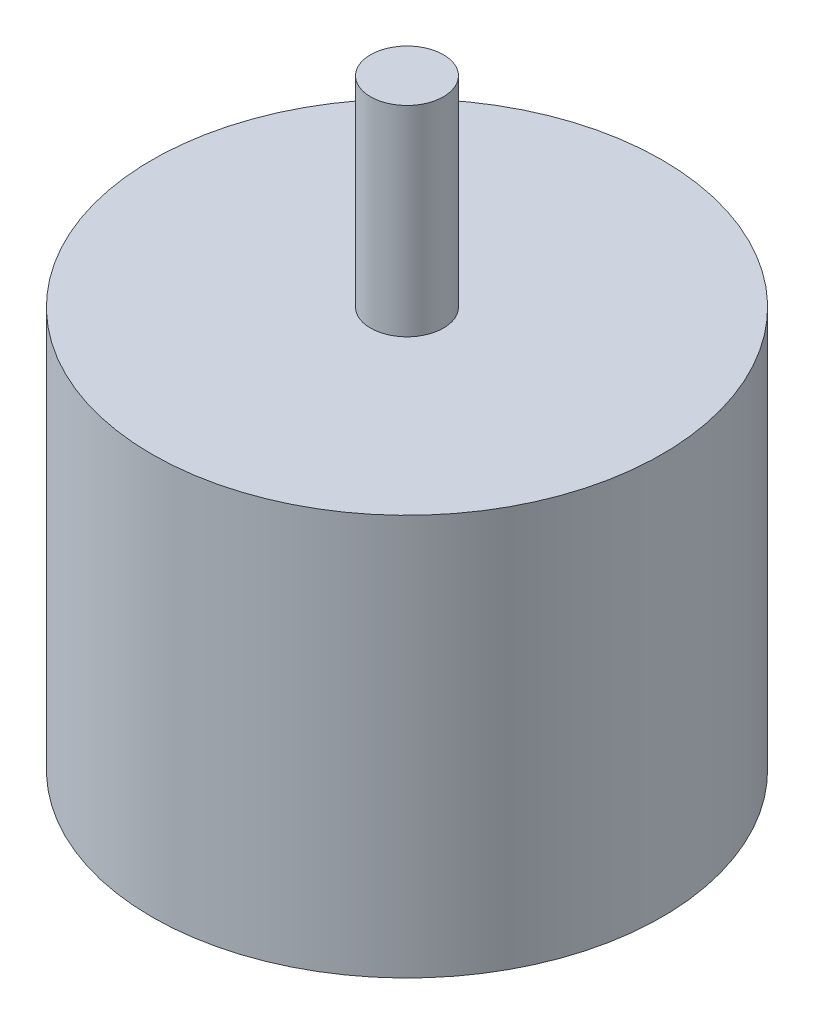
ISO-10303-21;
HEADER;
FILE_DESCRIPTION(('STEP AP214'),'2;1');
FILE_NAME('part.step','',(''),(''),'','','');
FILE_SCHEMA(('AUTOMOTIVE_DESIGN { 1 0 10303 214 1 1 1 1 }'));
ENDSEC;
DATA;
#1=APPLICATION_CONTEXT('core data for automotive mechanical design processes');
#2=APPLICATION_PROTOCOL_DEFINITION('international standard','automotive_design',2000,#1);
#3=PRODUCT_CONTEXT('',#1,'mechanical');
#4=PRODUCT('Part','Part','',(#3));
#5=PRODUCT_RELATED_PRODUCT_CATEGORY('part','',(#4));
#6=PRODUCT_DEFINITION_FORMATION('','',#4);
#7=PRODUCT_DEFINITION_CONTEXT('part definition',#1,'design');
#8=PRODUCT_DEFINITION('design','',#6,#7);
#9=PRODUCT_DEFINITION_SHAPE('','',#8);
#10=(LENGTH_UNIT() NAMED_UNIT(*) SI_UNIT(.MILLI.,.METRE.));
#11=(NAMED_UNIT(*) PLANE_ANGLE_UNIT() SI_UNIT($,.RADIAN.));
#12=(NAMED_UNIT(*) SI_UNIT($,.STERADIAN.) SOLID_ANGLE_UNIT());
#13=UNCERTAINTY_MEASURE_WITH_UNIT(LENGTH_MEASURE(1.E-05),#10,'distance_accuracy_value','');
#14=(GEOMETRIC_REPRESENTATION_CONTEXT(3) GLOBAL_UNCERTAINTY_ASSIGNED_CONTEXT((#13)) GLOBAL_UNIT_ASSIGNED_CONTEXT((#10,
#11,#12)) REPRESENTATION_CONTEXT('',''));
#15=CARTESIAN_POINT('',(0.,0.,0.));
#16=DIRECTION('',(0.,0.,1.));
#17=DIRECTION('',(1.,0.,0.));
#18=AXIS2_PLACEMENT_3D('',#15,#16,#17);
#19=CARTESIAN_POINT('',(0.,34.925,0.));
#20=DIRECTION('',(0.,1.,0.));
#21=DIRECTION('',(0.,0.,1.));
#22=AXIS2_PLACEMENT_3D('',#19,#20,#21);
#23=PLANE('',#22);
#24=CARTESIAN_POINT('',(0.,34.925,0.));
#25=DIRECTION('',(0.,1.,0.));
#26=DIRECTION('',(0.,0.,1.));
#27=AXIS2_PLACEMENT_3D('',#24,#25,#26);
#28=CIRCLE('',#27,22.225);
#29=CARTESIAN_POINT('',(0.,34.925,22.225));
#30=VERTEX_POINT('',#29);
#31=EDGE_CURVE('E10',#30,#30,#28,.T.);
#32=ORIENTED_EDGE('',*,*,#31,.T.);
#33=EDGE_LOOP('',(#32));
#34=FACE_BOUND('',#33,.T.);
#35=CARTESIAN_POINT('',(0.,34.925,0.));
#36=DIRECTION('',(0.,1.,0.));
#37=DIRECTION('',(0.,0.,1.));
#38=AXIS2_PLACEMENT_3D('',#35,#36,#37);
#39=CIRCLE('',#38,3.175);
#40=CARTESIAN_POINT('',(0.,34.925,3.175));
#41=VERTEX_POINT('',#40);
#42=EDGE_CURVE('E44',#41,#41,#39,.T.);
#43=ORIENTED_EDGE('',*,*,#42,.F.);
#44=EDGE_LOOP('',(#43));
#45=FACE_BOUND('',#44,.T.);
#46=ADVANCED_FACE('F31',(#34,#45),#23,.T.);
#47=CARTESIAN_POINT('',(0.,34.925,0.));
#48=DIRECTION('',(0.,-1.,0.));
#49=DIRECTION('',(0.,0.,-1.));
#50=AXIS2_PLACEMENT_3D('',#47,#48,#49);
#51=CYLINDRICAL_SURFACE('',#50,22.225);
#52=ORIENTED_EDGE('',*,*,#31,.F.);
#53=EDGE_LOOP('',(#52));
#54=FACE_BOUND('',#53,.T.);
#55=CARTESIAN_POINT('',(0.,0.,0.));
#56=DIRECTION('',(0.,1.,0.));
#57=DIRECTION('',(0.,0.,1.));
#58=AXIS2_PLACEMENT_3D('',#55,#56,#57);
#59=CIRCLE('',#58,22.225);
#60=CARTESIAN_POINT('',(0.,0.,22.225));
#61=VERTEX_POINT('',#60);
#62=EDGE_CURVE('E35',#61,#61,#59,.T.);
#63=ORIENTED_EDGE('',*,*,#62,.T.);
#64=EDGE_LOOP('',(#63));
#65=FACE_BOUND('',#64,.T.);
#66=ADVANCED_FACE('F33',(#54,#65),#51,.T.);
#67=CARTESIAN_POINT('',(0.,0.,0.));
#68=DIRECTION('',(0.,1.,0.));
#69=DIRECTION('',(0.,0.,1.));
#70=AXIS2_PLACEMENT_3D('',#67,#68,#69);
#71=PLANE('',#70);
#72=ORIENTED_EDGE('',*,*,#62,.F.);
#73=EDGE_LOOP('',(#72));
#74=FACE_BOUND('',#73,.T.);
#75=ADVANCED_FACE('F55',(#74),#71,.F.);
#76=CARTESIAN_POINT('',(0.,52.3875,0.));
#77=DIRECTION('',(0.,-1.,0.));
#78=DIRECTION('',(0.,0.,-1.));
#79=AXIS2_PLACEMENT_3D('',#76,#77,#78);
#80=CYLINDRICAL_SURFACE('',#79,3.175);
#81=CARTESIAN_POINT('',(0.,52.3875,0.));
#82=DIRECTION('',(0.,1.,0.));
#83=DIRECTION('',(0.,0.,1.));
#84=AXIS2_PLACEMENT_3D('',#81,#82,#83);
#85=CIRCLE('',#84,3.175);
#86=CARTESIAN_POINT('',(0.,52.3875,3.175));
#87=VERTEX_POINT('',#86);
#88=EDGE_CURVE('E42',#87,#87,#85,.T.);
#89=ORIENTED_EDGE('',*,*,#88,.F.);
#90=EDGE_LOOP('',(#89));
#91=FACE_BOUND('',#90,.T.);
#92=ORIENTED_EDGE('',*,*,#42,.T.);
#93=EDGE_LOOP('',(#92));
#94=FACE_BOUND('',#93,.T.);
#95=ADVANCED_FACE('F52',(#91,#94),#80,.T.);
#96=CARTESIAN_POINT('',(0.,52.3875,0.));
#97=DIRECTION('',(0.,1.,0.));
#98=DIRECTION('',(0.,0.,1.));
#99=AXIS2_PLACEMENT_3D('',#96,#97,#98);
#100=PLANE('',#99);
#101=ORIENTED_EDGE('',*,*,#88,.T.);
#102=EDGE_LOOP('',(#101));
#103=FACE_BOUND('',#102,.T.);
#104=ADVANCED_FACE('F50',(#103),#100,.T.);
#105=CLOSED_SHELL('',(#46,#66,#75,#95,#104));
#106=MANIFOLD_SOLID_BREP('B2',#105);
#107=ADVANCED_BREP_SHAPE_REPRESENTATION('',(#18,#106),#14);
#108=SHAPE_DEFINITION_REPRESENTATION(#9,#107);
ENDSEC;
END-ISO-10303-21;
